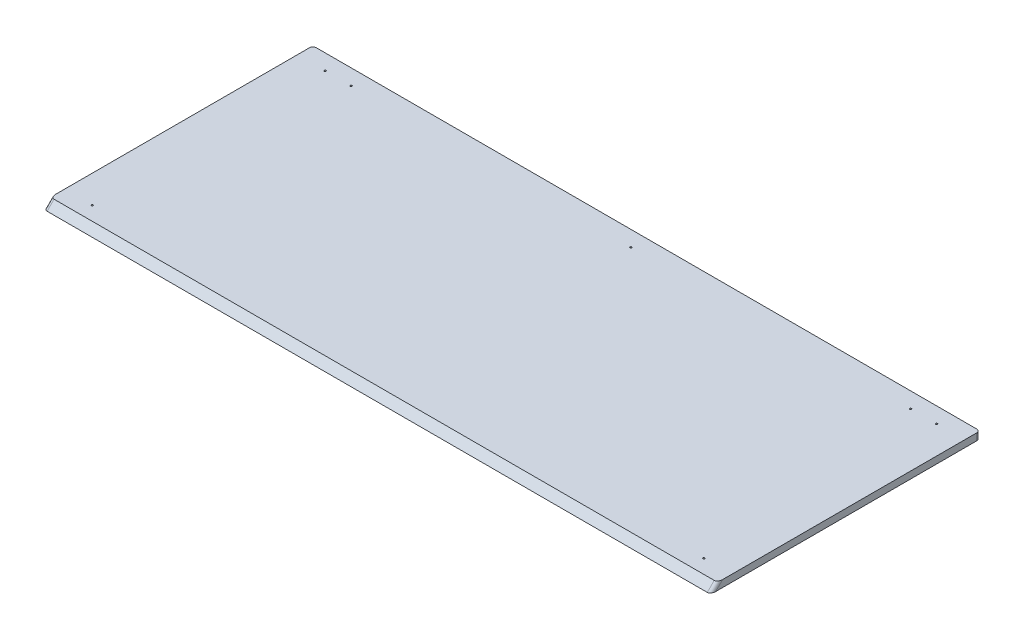
ISO-10303-21;
HEADER;
FILE_DESCRIPTION(('STEP AP214'),'2;1');
FILE_NAME('part.step','',(''),(''),'','','');
FILE_SCHEMA(('AUTOMOTIVE_DESIGN { 1 0 10303 214 1 1 1 1 }'));
ENDSEC;
DATA;
#1=APPLICATION_CONTEXT('core data for automotive mechanical design processes');
#2=APPLICATION_PROTOCOL_DEFINITION('international standard','automotive_design',2000,#1);
#3=PRODUCT_CONTEXT('',#1,'mechanical');
#4=PRODUCT('Part','Part','',(#3));
#5=PRODUCT_RELATED_PRODUCT_CATEGORY('part','',(#4));
#6=PRODUCT_DEFINITION_FORMATION('','',#4);
#7=PRODUCT_DEFINITION_CONTEXT('part definition',#1,'design');
#8=PRODUCT_DEFINITION('design','',#6,#7);
#9=PRODUCT_DEFINITION_SHAPE('','',#8);
#10=(LENGTH_UNIT() NAMED_UNIT(*) SI_UNIT(.MILLI.,.METRE.));
#11=(NAMED_UNIT(*) PLANE_ANGLE_UNIT() SI_UNIT($,.RADIAN.));
#12=(NAMED_UNIT(*) SI_UNIT($,.STERADIAN.) SOLID_ANGLE_UNIT());
#13=UNCERTAINTY_MEASURE_WITH_UNIT(LENGTH_MEASURE(1.E-05),#10,'distance_accuracy_value','');
#14=(GEOMETRIC_REPRESENTATION_CONTEXT(3) GLOBAL_UNCERTAINTY_ASSIGNED_CONTEXT((#13)) GLOBAL_UNIT_ASSIGNED_CONTEXT((#10,
#11,#12)) REPRESENTATION_CONTEXT('',''));
#15=CARTESIAN_POINT('',(0.,0.,0.));
#16=DIRECTION('',(0.,0.,1.));
#17=DIRECTION('',(1.,0.,0.));
#18=AXIS2_PLACEMENT_3D('',#15,#16,#17);
#19=CARTESIAN_POINT('',(-603.25,21.54428,471.125463879014));
#20=DIRECTION('',(0.,0.707106781186548,-0.707106781186548));
#21=DIRECTION('',(0.,0.707106781186548,0.707106781186548));
#22=AXIS2_PLACEMENT_3D('',#19,#20,#21);
#23=CYLINDRICAL_SURFACE('',#22,6.35);
#24=DIRECTION('',(0.,-0.707106781186548,0.707106781186548));
#25=VECTOR('',#24,1.);
#26=CARTESIAN_POINT('',(-603.25,44.45,457.2));
#27=LINE('',#26,#25);
#28=CARTESIAN_POINT('',(-603.25,50.8,450.850000000042));
#29=VERTEX_POINT('',#28);
#30=CARTESIAN_POINT('',(-603.25,38.1,463.550000000042));
#31=VERTEX_POINT('',#30);
#32=EDGE_CURVE('E92',#29,#31,#27,.T.);
#33=ORIENTED_EDGE('',*,*,#32,.F.);
#34=CARTESIAN_POINT('',(-603.25,50.8,441.869743879014));
#35=DIRECTION('',(0.,1.,0.));
#36=DIRECTION('',(0.,0.,-1.));
#37=AXIS2_PLACEMENT_3D('',#34,#35,#36);
#38=ELLIPSE('',#37,8.98025612106915,6.35);
#39=CARTESIAN_POINT('',(-609.6,50.8,441.869743879014));
#40=VERTEX_POINT('',#39);
#41=EDGE_CURVE('E19',#40,#29,#38,.T.);
#42=ORIENTED_EDGE('',*,*,#41,.F.);
#43=DIRECTION('',(0.,0.707106781186548,-0.707106781186547));
#44=VECTOR('',#43,1.);
#45=CARTESIAN_POINT('',(-609.6,38.1,454.569743879014));
#46=LINE('',#45,#44);
#47=CARTESIAN_POINT('',(-609.6,38.1,454.569743879014));
#48=VERTEX_POINT('',#47);
#49=EDGE_CURVE('E78',#48,#40,#46,.T.);
#50=ORIENTED_EDGE('',*,*,#49,.F.);
#51=CARTESIAN_POINT('',(-603.25,38.1,454.569743879014));
#52=DIRECTION('',(0.,1.,0.));
#53=DIRECTION('',(0.,0.,-1.));
#54=AXIS2_PLACEMENT_3D('',#51,#52,#53);
#55=ELLIPSE('',#54,8.98025612106915,6.35);
#56=EDGE_CURVE('E134',#48,#31,#55,.T.);
#57=ORIENTED_EDGE('',*,*,#56,.T.);
#58=EDGE_LOOP('',(#33,#42,#50,#57));
#59=FACE_BOUND('',#58,.T.);
#60=ADVANCED_FACE('F16',(#59),#23,.T.);
#61=CARTESIAN_POINT('',(603.25,67.35572,425.314023879014));
#62=DIRECTION('',(0.,-0.707106781186548,0.707106781186548));
#63=DIRECTION('',(0.,-0.707106781186548,-0.707106781186548));
#64=AXIS2_PLACEMENT_3D('',#61,#62,#63);
#65=CYLINDRICAL_SURFACE('',#64,6.35);
#66=DIRECTION('',(0.,-0.707106781186548,0.707106781186547));
#67=VECTOR('',#66,1.);
#68=CARTESIAN_POINT('',(609.6,50.8,441.869743879014));
#69=LINE('',#68,#67);
#70=CARTESIAN_POINT('',(609.6,50.8,441.869743879014));
#71=VERTEX_POINT('',#70);
#72=CARTESIAN_POINT('',(609.6,38.1,454.569743879014));
#73=VERTEX_POINT('',#72);
#74=EDGE_CURVE('E164',#71,#73,#69,.T.);
#75=ORIENTED_EDGE('',*,*,#74,.F.);
#76=CARTESIAN_POINT('',(603.25,50.8,441.869743879014));
#77=DIRECTION('',(0.,1.,0.));
#78=DIRECTION('',(0.,0.,1.));
#79=AXIS2_PLACEMENT_3D('',#76,#77,#78);
#80=ELLIPSE('',#79,8.98025612106915,6.35);
#81=CARTESIAN_POINT('',(603.25,50.8,450.850000000042));
#82=VERTEX_POINT('',#81);
#83=EDGE_CURVE('E96',#82,#71,#80,.T.);
#84=ORIENTED_EDGE('',*,*,#83,.F.);
#85=DIRECTION('',(0.,-0.707106781186548,0.707106781186548));
#86=VECTOR('',#85,1.);
#87=CARTESIAN_POINT('',(603.25,44.45,457.2));
#88=LINE('',#87,#86);
#89=CARTESIAN_POINT('',(603.25,38.1,463.550000000042));
#90=VERTEX_POINT('',#89);
#91=EDGE_CURVE('E102',#90,#82,#88,.F.);
#92=ORIENTED_EDGE('',*,*,#91,.F.);
#93=CARTESIAN_POINT('',(603.25,38.1,454.569743879014));
#94=DIRECTION('',(0.,1.,0.));
#95=DIRECTION('',(0.,0.,1.));
#96=AXIS2_PLACEMENT_3D('',#93,#94,#95);
#97=ELLIPSE('',#96,8.98025612106915,6.35);
#98=EDGE_CURVE('E130',#90,#73,#97,.T.);
#99=ORIENTED_EDGE('',*,*,#98,.T.);
#100=EDGE_LOOP('',(#75,#84,#92,#99));
#101=FACE_BOUND('',#100,.T.);
#102=ADVANCED_FACE('F178',(#101),#65,.T.);
#103=CARTESIAN_POINT('',(0.,50.8,0.));
#104=DIRECTION('',(0.,1.,0.));
#105=DIRECTION('',(0.,0.,1.));
#106=AXIS2_PLACEMENT_3D('',#103,#104,#105);
#107=PLANE('',#106);
#108=CARTESIAN_POINT('',(-558.8,50.8,425.45));
#109=DIRECTION('',(0.,1.,0.));
#110=DIRECTION('',(0.,0.,1.));
#111=AXIS2_PLACEMENT_3D('',#108,#109,#110);
#112=CIRCLE('',#111,1.5875);
#113=CARTESIAN_POINT('',(-558.8,50.8,427.0375));
#114=VERTEX_POINT('',#113);
#115=EDGE_CURVE('E139',#114,#114,#112,.F.);
#116=ORIENTED_EDGE('',*,*,#115,.T.);
#117=EDGE_LOOP('',(#116));
#118=FACE_BOUND('',#117,.T.);
#119=CARTESIAN_POINT('',(558.8,50.8,425.45));
#120=DIRECTION('',(0.,1.,0.));
#121=DIRECTION('',(0.,0.,1.));
#122=AXIS2_PLACEMENT_3D('',#119,#120,#121);
#123=CIRCLE('',#122,1.5875);
#124=CARTESIAN_POINT('',(558.8,50.8,427.0375));
#125=VERTEX_POINT('',#124);
#126=EDGE_CURVE('E142',#125,#125,#123,.F.);
#127=ORIENTED_EDGE('',*,*,#126,.T.);
#128=EDGE_LOOP('',(#127));
#129=FACE_BOUND('',#128,.T.);
#130=CARTESIAN_POINT('',(558.8,50.8,0.));
#131=DIRECTION('',(0.,1.,0.));
#132=DIRECTION('',(0.,0.,1.));
#133=AXIS2_PLACEMENT_3D('',#130,#131,#132);
#134=CIRCLE('',#133,1.5875);
#135=CARTESIAN_POINT('',(558.8,50.8,1.5875));
#136=VERTEX_POINT('',#135);
#137=EDGE_CURVE('E145',#136,#136,#134,.F.);
#138=ORIENTED_EDGE('',*,*,#137,.T.);
#139=EDGE_LOOP('',(#138));
#140=FACE_BOUND('',#139,.T.);
#141=CARTESIAN_POINT('',(-558.8,50.8,0.));
#142=DIRECTION('',(0.,1.,0.));
#143=DIRECTION('',(0.,0.,1.));
#144=AXIS2_PLACEMENT_3D('',#141,#142,#143);
#145=CIRCLE('',#144,1.5875);
#146=CARTESIAN_POINT('',(-558.8,50.8,1.5875));
#147=VERTEX_POINT('',#146);
#148=EDGE_CURVE('E148',#147,#147,#145,.F.);
#149=ORIENTED_EDGE('',*,*,#148,.T.);
#150=EDGE_LOOP('',(#149));
#151=FACE_BOUND('',#150,.T.);
#152=CARTESIAN_POINT('',(-511.175,50.8,0.));
#153=DIRECTION('',(0.,1.,0.));
#154=DIRECTION('',(0.,0.,1.));
#155=AXIS2_PLACEMENT_3D('',#152,#153,#154);
#156=CIRCLE('',#155,1.5875);
#157=CARTESIAN_POINT('',(-511.175,50.8,1.5875));
#158=VERTEX_POINT('',#157);
#159=EDGE_CURVE('E151',#158,#158,#156,.F.);
#160=ORIENTED_EDGE('',*,*,#159,.T.);
#161=EDGE_LOOP('',(#160));
#162=FACE_BOUND('',#161,.T.);
#163=CARTESIAN_POINT('',(511.175,50.8,0.));
#164=DIRECTION('',(0.,1.,0.));
#165=DIRECTION('',(0.,0.,1.));
#166=AXIS2_PLACEMENT_3D('',#163,#164,#165);
#167=CIRCLE('',#166,1.5875);
#168=CARTESIAN_POINT('',(511.175,50.8,1.5875));
#169=VERTEX_POINT('',#168);
#170=EDGE_CURVE('E154',#169,#169,#167,.F.);
#171=ORIENTED_EDGE('',*,*,#170,.T.);
#172=EDGE_LOOP('',(#171));
#173=FACE_BOUND('',#172,.T.);
#174=CARTESIAN_POINT('',(0.,50.8,0.));
#175=DIRECTION('',(0.,1.,0.));
#176=DIRECTION('',(0.,0.,1.));
#177=AXIS2_PLACEMENT_3D('',#174,#175,#176);
#178=CIRCLE('',#177,1.5875);
#179=CARTESIAN_POINT('',(0.,50.8,1.5875));
#180=VERTEX_POINT('',#179);
#181=EDGE_CURVE('E157',#180,#180,#178,.F.);
#182=ORIENTED_EDGE('',*,*,#181,.T.);
#183=EDGE_LOOP('',(#182));
#184=FACE_BOUND('',#183,.T.);
#185=DIRECTION('',(-1.,0.,0.));
#186=VECTOR('',#185,1.);
#187=CARTESIAN_POINT('',(609.6,50.8,-28.575));
#188=LINE('',#187,#186);
#189=CARTESIAN_POINT('',(-603.25,50.8,-28.575));
#190=VERTEX_POINT('',#189);
#191=CARTESIAN_POINT('',(603.25,50.8,-28.575));
#192=VERTEX_POINT('',#191);
#193=EDGE_CURVE('E185',#190,#192,#188,.F.);
#194=ORIENTED_EDGE('',*,*,#193,.F.);
#195=CARTESIAN_POINT('',(-603.25,50.8,-22.225));
#196=DIRECTION('',(0.,-1.,0.));
#197=DIRECTION('',(0.,0.,-1.));
#198=AXIS2_PLACEMENT_3D('',#195,#196,#197);
#199=CIRCLE('',#198,6.35);
#200=CARTESIAN_POINT('',(-609.6,50.8,-22.225));
#201=VERTEX_POINT('',#200);
#202=EDGE_CURVE('E88',#201,#190,#199,.T.);
#203=ORIENTED_EDGE('',*,*,#202,.F.);
#204=DIRECTION('',(0.,0.,1.));
#205=VECTOR('',#204,1.);
#206=CARTESIAN_POINT('',(-609.6,50.8,-28.575));
#207=LINE('',#206,#205);
#208=EDGE_CURVE('E82',#40,#201,#207,.F.);
#209=ORIENTED_EDGE('',*,*,#208,.F.);
#210=ORIENTED_EDGE('',*,*,#41,.T.);
#211=DIRECTION('',(1.,0.,0.));
#212=VECTOR('',#211,1.);
#213=CARTESIAN_POINT('',(7.2191141953216E-13,50.8,450.85));
#214=LINE('',#213,#212);
#215=EDGE_CURVE('E105',#82,#29,#214,.F.);
#216=ORIENTED_EDGE('',*,*,#215,.F.);
#217=ORIENTED_EDGE('',*,*,#83,.T.);
#218=DIRECTION('',(0.,0.,-1.));
#219=VECTOR('',#218,1.);
#220=CARTESIAN_POINT('',(609.6,50.8,463.55));
#221=LINE('',#220,#219);
#222=CARTESIAN_POINT('',(609.6,50.8,-22.225));
#223=VERTEX_POINT('',#222);
#224=EDGE_CURVE('E169',#223,#71,#221,.F.);
#225=ORIENTED_EDGE('',*,*,#224,.F.);
#226=CARTESIAN_POINT('',(603.25,50.8,-22.225));
#227=DIRECTION('',(0.,-1.,0.));
#228=DIRECTION('',(0.,0.,-1.));
#229=AXIS2_PLACEMENT_3D('',#226,#227,#228);
#230=CIRCLE('',#229,6.35);
#231=EDGE_CURVE('E161',#192,#223,#230,.T.);
#232=ORIENTED_EDGE('',*,*,#231,.F.);
#233=EDGE_LOOP('',(#194,#203,#209,#210,#216,#217,#225,#232));
#234=FACE_BOUND('',#233,.T.);
#235=ADVANCED_FACE('F98',(#118,#129,#140,#151,#162,#173,#184,#234),#107,.T.);
#236=CARTESIAN_POINT('',(-603.25,67.35572,-22.225));
#237=DIRECTION('',(0.,-1.,0.));
#238=DIRECTION('',(0.,0.,-1.));
#239=AXIS2_PLACEMENT_3D('',#236,#237,#238);
#240=CYLINDRICAL_SURFACE('',#239,6.35);
#241=DIRECTION('',(0.,1.,0.));
#242=VECTOR('',#241,1.);
#243=CARTESIAN_POINT('',(-603.25,38.1,-28.575));
#244=LINE('',#243,#242);
#245=CARTESIAN_POINT('',(-603.25,38.1,-28.575));
#246=VERTEX_POINT('',#245);
#247=EDGE_CURVE('E160',#246,#190,#244,.T.);
#248=ORIENTED_EDGE('',*,*,#247,.F.);
#249=CARTESIAN_POINT('',(-603.25,38.1,-22.225));
#250=DIRECTION('',(0.,-1.,0.));
#251=DIRECTION('',(0.,0.,-1.));
#252=AXIS2_PLACEMENT_3D('',#249,#250,#251);
#253=CIRCLE('',#252,6.35);
#254=CARTESIAN_POINT('',(-609.6,38.1,-22.225));
#255=VERTEX_POINT('',#254);
#256=EDGE_CURVE('E136',#246,#255,#253,.F.);
#257=ORIENTED_EDGE('',*,*,#256,.T.);
#258=DIRECTION('',(0.,1.,0.));
#259=VECTOR('',#258,1.);
#260=CARTESIAN_POINT('',(-609.6,38.1,-22.225));
#261=LINE('',#260,#259);
#262=EDGE_CURVE('E100',#201,#255,#261,.F.);
#263=ORIENTED_EDGE('',*,*,#262,.F.);
#264=ORIENTED_EDGE('',*,*,#202,.T.);
#265=EDGE_LOOP('',(#248,#257,#263,#264));
#266=FACE_BOUND('',#265,.T.);
#267=ADVANCED_FACE('F201',(#266),#240,.T.);
#268=CARTESIAN_POINT('',(-609.6,38.1,-28.575));
#269=DIRECTION('',(-1.,0.,0.));
#270=DIRECTION('',(0.,0.,1.));
#271=AXIS2_PLACEMENT_3D('',#268,#269,#270);
#272=PLANE('',#271);
#273=ORIENTED_EDGE('',*,*,#208,.T.);
#274=ORIENTED_EDGE('',*,*,#262,.T.);
#275=DIRECTION('',(0.,0.,1.));
#276=VECTOR('',#275,1.);
#277=CARTESIAN_POINT('',(-609.6,38.1,0.));
#278=LINE('',#277,#276);
#279=EDGE_CURVE('E85',#255,#48,#278,.T.);
#280=ORIENTED_EDGE('',*,*,#279,.T.);
#281=ORIENTED_EDGE('',*,*,#49,.T.);
#282=EDGE_LOOP('',(#273,#274,#280,#281));
#283=FACE_BOUND('',#282,.T.);
#284=ADVANCED_FACE('F80',(#283),#272,.T.);
#285=CARTESIAN_POINT('',(7.2191141953216E-13,44.45,457.2));
#286=DIRECTION('',(0.,0.707106781186548,0.707106781186548));
#287=DIRECTION('',(0.,-0.707106781186548,0.707106781186548));
#288=AXIS2_PLACEMENT_3D('',#285,#286,#287);
#289=PLANE('',#288);
#290=ORIENTED_EDGE('',*,*,#215,.T.);
#291=ORIENTED_EDGE('',*,*,#32,.T.);
#292=DIRECTION('',(1.,0.,0.));
#293=VECTOR('',#292,1.);
#294=CARTESIAN_POINT('',(0.,38.1,463.55));
#295=LINE('',#294,#293);
#296=EDGE_CURVE('E133',#31,#90,#295,.T.);
#297=ORIENTED_EDGE('',*,*,#296,.T.);
#298=ORIENTED_EDGE('',*,*,#91,.T.);
#299=EDGE_LOOP('',(#290,#291,#297,#298));
#300=FACE_BOUND('',#299,.T.);
#301=ADVANCED_FACE('F204',(#300),#289,.T.);
#302=CARTESIAN_POINT('',(609.6,38.1,463.55));
#303=DIRECTION('',(1.,0.,0.));
#304=DIRECTION('',(0.,0.,-1.));
#305=AXIS2_PLACEMENT_3D('',#302,#303,#304);
#306=PLANE('',#305);
#307=DIRECTION('',(0.,0.,1.));
#308=VECTOR('',#307,1.);
#309=CARTESIAN_POINT('',(609.6,38.1,0.));
#310=LINE('',#309,#308);
#311=CARTESIAN_POINT('',(609.6,38.1,-22.225));
#312=VERTEX_POINT('',#311);
#313=EDGE_CURVE('E129',#73,#312,#310,.F.);
#314=ORIENTED_EDGE('',*,*,#313,.T.);
#315=DIRECTION('',(0.,-1.,0.));
#316=VECTOR('',#315,1.);
#317=CARTESIAN_POINT('',(609.6,67.35572,-22.225));
#318=LINE('',#317,#316);
#319=EDGE_CURVE('E163',#223,#312,#318,.T.);
#320=ORIENTED_EDGE('',*,*,#319,.F.);
#321=ORIENTED_EDGE('',*,*,#224,.T.);
#322=ORIENTED_EDGE('',*,*,#74,.T.);
#323=EDGE_LOOP('',(#314,#320,#321,#322));
#324=FACE_BOUND('',#323,.T.);
#325=ADVANCED_FACE('F176',(#324),#306,.T.);
#326=CARTESIAN_POINT('',(603.25,67.35572,-22.225));
#327=DIRECTION('',(0.,-1.,0.));
#328=DIRECTION('',(0.,0.,-1.));
#329=AXIS2_PLACEMENT_3D('',#326,#327,#328);
#330=CYLINDRICAL_SURFACE('',#329,6.35);
#331=ORIENTED_EDGE('',*,*,#319,.T.);
#332=CARTESIAN_POINT('',(603.25,38.1,-22.225));
#333=DIRECTION('',(0.,-1.,0.));
#334=DIRECTION('',(0.,0.,-1.));
#335=AXIS2_PLACEMENT_3D('',#332,#333,#334);
#336=CIRCLE('',#335,6.35);
#337=CARTESIAN_POINT('',(603.25,38.1,-28.575));
#338=VERTEX_POINT('',#337);
#339=EDGE_CURVE('E126',#312,#338,#336,.F.);
#340=ORIENTED_EDGE('',*,*,#339,.T.);
#341=DIRECTION('',(0.,1.,0.));
#342=VECTOR('',#341,1.);
#343=CARTESIAN_POINT('',(603.25,38.1,-28.575));
#344=LINE('',#343,#342);
#345=EDGE_CURVE('E34',#192,#338,#344,.F.);
#346=ORIENTED_EDGE('',*,*,#345,.F.);
#347=ORIENTED_EDGE('',*,*,#231,.T.);
#348=EDGE_LOOP('',(#331,#340,#346,#347));
#349=FACE_BOUND('',#348,.T.);
#350=ADVANCED_FACE('F190',(#349),#330,.T.);
#351=CARTESIAN_POINT('',(609.6,38.1,-28.575));
#352=DIRECTION('',(0.,0.,-1.));
#353=DIRECTION('',(-1.,0.,0.));
#354=AXIS2_PLACEMENT_3D('',#351,#352,#353);
#355=PLANE('',#354);
#356=DIRECTION('',(1.,0.,0.));
#357=VECTOR('',#356,1.);
#358=CARTESIAN_POINT('',(0.,38.1,-28.575));
#359=LINE('',#358,#357);
#360=EDGE_CURVE('E125',#338,#246,#359,.F.);
#361=ORIENTED_EDGE('',*,*,#360,.T.);
#362=ORIENTED_EDGE('',*,*,#247,.T.);
#363=ORIENTED_EDGE('',*,*,#193,.T.);
#364=ORIENTED_EDGE('',*,*,#345,.T.);
#365=EDGE_LOOP('',(#361,#362,#363,#364));
#366=FACE_BOUND('',#365,.T.);
#367=ADVANCED_FACE('F199',(#366),#355,.T.);
#368=CARTESIAN_POINT('',(0.,50.8,0.));
#369=DIRECTION('',(0.,1.,0.));
#370=DIRECTION('',(0.,0.,1.));
#371=AXIS2_PLACEMENT_3D('',#368,#369,#370);
#372=CYLINDRICAL_SURFACE('',#371,1.5875);
#373=ORIENTED_EDGE('',*,*,#181,.F.);
#374=EDGE_LOOP('',(#373));
#375=FACE_BOUND('',#374,.T.);
#376=CARTESIAN_POINT('',(0.,38.1,0.));
#377=DIRECTION('',(0.,1.,0.));
#378=DIRECTION('',(0.,0.,1.));
#379=AXIS2_PLACEMENT_3D('',#376,#377,#378);
#380=CIRCLE('',#379,1.5875);
#381=CARTESIAN_POINT('',(0.,38.1,1.5875));
#382=VERTEX_POINT('',#381);
#383=EDGE_CURVE('E122',#382,#382,#380,.F.);
#384=ORIENTED_EDGE('',*,*,#383,.T.);
#385=EDGE_LOOP('',(#384));
#386=FACE_BOUND('',#385,.T.);
#387=ADVANCED_FACE('F245',(#375,#386),#372,.F.);
#388=CARTESIAN_POINT('',(511.175,50.8,0.));
#389=DIRECTION('',(0.,1.,0.));
#390=DIRECTION('',(0.,0.,1.));
#391=AXIS2_PLACEMENT_3D('',#388,#389,#390);
#392=CYLINDRICAL_SURFACE('',#391,1.5875);
#393=ORIENTED_EDGE('',*,*,#170,.F.);
#394=EDGE_LOOP('',(#393));
#395=FACE_BOUND('',#394,.T.);
#396=CARTESIAN_POINT('',(511.175,38.1,0.));
#397=DIRECTION('',(0.,1.,0.));
#398=DIRECTION('',(0.,0.,1.));
#399=AXIS2_PLACEMENT_3D('',#396,#397,#398);
#400=CIRCLE('',#399,1.5875);
#401=CARTESIAN_POINT('',(511.175,38.1,1.5875));
#402=VERTEX_POINT('',#401);
#403=EDGE_CURVE('E119',#402,#402,#400,.F.);
#404=ORIENTED_EDGE('',*,*,#403,.T.);
#405=EDGE_LOOP('',(#404));
#406=FACE_BOUND('',#405,.T.);
#407=ADVANCED_FACE('F241',(#395,#406),#392,.F.);
#408=CARTESIAN_POINT('',(-511.175,50.8,0.));
#409=DIRECTION('',(0.,1.,0.));
#410=DIRECTION('',(0.,0.,1.));
#411=AXIS2_PLACEMENT_3D('',#408,#409,#410);
#412=CYLINDRICAL_SURFACE('',#411,1.5875);
#413=ORIENTED_EDGE('',*,*,#159,.F.);
#414=EDGE_LOOP('',(#413));
#415=FACE_BOUND('',#414,.T.);
#416=CARTESIAN_POINT('',(-511.175,38.1,0.));
#417=DIRECTION('',(0.,1.,0.));
#418=DIRECTION('',(0.,0.,1.));
#419=AXIS2_PLACEMENT_3D('',#416,#417,#418);
#420=CIRCLE('',#419,1.5875);
#421=CARTESIAN_POINT('',(-511.175,38.1,1.5875));
#422=VERTEX_POINT('',#421);
#423=EDGE_CURVE('E116',#422,#422,#420,.F.);
#424=ORIENTED_EDGE('',*,*,#423,.T.);
#425=EDGE_LOOP('',(#424));
#426=FACE_BOUND('',#425,.T.);
#427=ADVANCED_FACE('F237',(#415,#426),#412,.F.);
#428=CARTESIAN_POINT('',(-558.8,50.8,0.));
#429=DIRECTION('',(0.,1.,0.));
#430=DIRECTION('',(0.,0.,1.));
#431=AXIS2_PLACEMENT_3D('',#428,#429,#430);
#432=CYLINDRICAL_SURFACE('',#431,1.5875);
#433=ORIENTED_EDGE('',*,*,#148,.F.);
#434=EDGE_LOOP('',(#433));
#435=FACE_BOUND('',#434,.T.);
#436=CARTESIAN_POINT('',(-558.8,38.1,0.));
#437=DIRECTION('',(0.,1.,0.));
#438=DIRECTION('',(0.,0.,1.));
#439=AXIS2_PLACEMENT_3D('',#436,#437,#438);
#440=CIRCLE('',#439,1.5875);
#441=CARTESIAN_POINT('',(-558.8,38.1,1.5875));
#442=VERTEX_POINT('',#441);
#443=EDGE_CURVE('E113',#442,#442,#440,.F.);
#444=ORIENTED_EDGE('',*,*,#443,.T.);
#445=EDGE_LOOP('',(#444));
#446=FACE_BOUND('',#445,.T.);
#447=ADVANCED_FACE('F233',(#435,#446),#432,.F.);
#448=CARTESIAN_POINT('',(558.8,50.8,0.));
#449=DIRECTION('',(0.,1.,0.));
#450=DIRECTION('',(0.,0.,1.));
#451=AXIS2_PLACEMENT_3D('',#448,#449,#450);
#452=CYLINDRICAL_SURFACE('',#451,1.5875);
#453=ORIENTED_EDGE('',*,*,#137,.F.);
#454=EDGE_LOOP('',(#453));
#455=FACE_BOUND('',#454,.T.);
#456=CARTESIAN_POINT('',(558.8,38.1,0.));
#457=DIRECTION('',(0.,1.,0.));
#458=DIRECTION('',(0.,0.,1.));
#459=AXIS2_PLACEMENT_3D('',#456,#457,#458);
#460=CIRCLE('',#459,1.5875);
#461=CARTESIAN_POINT('',(558.8,38.1,1.5875));
#462=VERTEX_POINT('',#461);
#463=EDGE_CURVE('E110',#462,#462,#460,.F.);
#464=ORIENTED_EDGE('',*,*,#463,.T.);
#465=EDGE_LOOP('',(#464));
#466=FACE_BOUND('',#465,.T.);
#467=ADVANCED_FACE('F229',(#455,#466),#452,.F.);
#468=CARTESIAN_POINT('',(558.8,50.8,425.45));
#469=DIRECTION('',(0.,1.,0.));
#470=DIRECTION('',(0.,0.,1.));
#471=AXIS2_PLACEMENT_3D('',#468,#469,#470);
#472=CYLINDRICAL_SURFACE('',#471,1.5875);
#473=ORIENTED_EDGE('',*,*,#126,.F.);
#474=EDGE_LOOP('',(#473));
#475=FACE_BOUND('',#474,.T.);
#476=CARTESIAN_POINT('',(558.8,38.1,425.45));
#477=DIRECTION('',(0.,1.,0.));
#478=DIRECTION('',(0.,0.,1.));
#479=AXIS2_PLACEMENT_3D('',#476,#477,#478);
#480=CIRCLE('',#479,1.5875);
#481=CARTESIAN_POINT('',(558.8,38.1,427.0375));
#482=VERTEX_POINT('',#481);
#483=EDGE_CURVE('E25',#482,#482,#480,.F.);
#484=ORIENTED_EDGE('',*,*,#483,.T.);
#485=EDGE_LOOP('',(#484));
#486=FACE_BOUND('',#485,.T.);
#487=ADVANCED_FACE('F221',(#475,#486),#472,.F.);
#488=CARTESIAN_POINT('',(-558.8,50.8,425.45));
#489=DIRECTION('',(0.,1.,0.));
#490=DIRECTION('',(0.,0.,1.));
#491=AXIS2_PLACEMENT_3D('',#488,#489,#490);
#492=CYLINDRICAL_SURFACE('',#491,1.5875);
#493=ORIENTED_EDGE('',*,*,#115,.F.);
#494=EDGE_LOOP('',(#493));
#495=FACE_BOUND('',#494,.T.);
#496=CARTESIAN_POINT('',(-558.8,38.1,425.45));
#497=DIRECTION('',(0.,1.,0.));
#498=DIRECTION('',(0.,0.,1.));
#499=AXIS2_PLACEMENT_3D('',#496,#497,#498);
#500=CIRCLE('',#499,1.5875);
#501=CARTESIAN_POINT('',(-558.8,38.1,427.0375));
#502=VERTEX_POINT('',#501);
#503=EDGE_CURVE('E11',#502,#502,#500,.F.);
#504=ORIENTED_EDGE('',*,*,#503,.T.);
#505=EDGE_LOOP('',(#504));
#506=FACE_BOUND('',#505,.T.);
#507=ADVANCED_FACE('F215',(#495,#506),#492,.F.);
#508=CARTESIAN_POINT('',(0.,38.1,0.));
#509=DIRECTION('',(0.,1.,0.));
#510=DIRECTION('',(0.,0.,1.));
#511=AXIS2_PLACEMENT_3D('',#508,#509,#510);
#512=PLANE('',#511);
#513=ORIENTED_EDGE('',*,*,#503,.F.);
#514=EDGE_LOOP('',(#513));
#515=FACE_BOUND('',#514,.T.);
#516=ORIENTED_EDGE('',*,*,#483,.F.);
#517=EDGE_LOOP('',(#516));
#518=FACE_BOUND('',#517,.T.);
#519=ORIENTED_EDGE('',*,*,#463,.F.);
#520=EDGE_LOOP('',(#519));
#521=FACE_BOUND('',#520,.T.);
#522=ORIENTED_EDGE('',*,*,#443,.F.);
#523=EDGE_LOOP('',(#522));
#524=FACE_BOUND('',#523,.T.);
#525=ORIENTED_EDGE('',*,*,#423,.F.);
#526=EDGE_LOOP('',(#525));
#527=FACE_BOUND('',#526,.T.);
#528=ORIENTED_EDGE('',*,*,#403,.F.);
#529=EDGE_LOOP('',(#528));
#530=FACE_BOUND('',#529,.T.);
#531=ORIENTED_EDGE('',*,*,#383,.F.);
#532=EDGE_LOOP('',(#531));
#533=FACE_BOUND('',#532,.T.);
#534=ORIENTED_EDGE('',*,*,#339,.F.);
#535=ORIENTED_EDGE('',*,*,#313,.F.);
#536=ORIENTED_EDGE('',*,*,#98,.F.);
#537=ORIENTED_EDGE('',*,*,#296,.F.);
#538=ORIENTED_EDGE('',*,*,#56,.F.);
#539=ORIENTED_EDGE('',*,*,#279,.F.);
#540=ORIENTED_EDGE('',*,*,#256,.F.);
#541=ORIENTED_EDGE('',*,*,#360,.F.);
#542=EDGE_LOOP('',(#534,#535,#536,#537,#538,#539,#540,#541));
#543=FACE_BOUND('',#542,.T.);
#544=ADVANCED_FACE('F192',(#515,#518,#521,#524,#527,#530,#533,#543),#512,.F.);
#545=CLOSED_SHELL('',(#60,#102,#235,#267,#284,#301,#325,#350,#367,#387,#407,#427,#447,#467,#487,
#507,#544));
#546=MANIFOLD_SOLID_BREP('B1',#545);
#547=ADVANCED_BREP_SHAPE_REPRESENTATION('',(#18,#546),#14);
#548=SHAPE_DEFINITION_REPRESENTATION(#9,#547);
ENDSEC;
END-ISO-10303-21;
